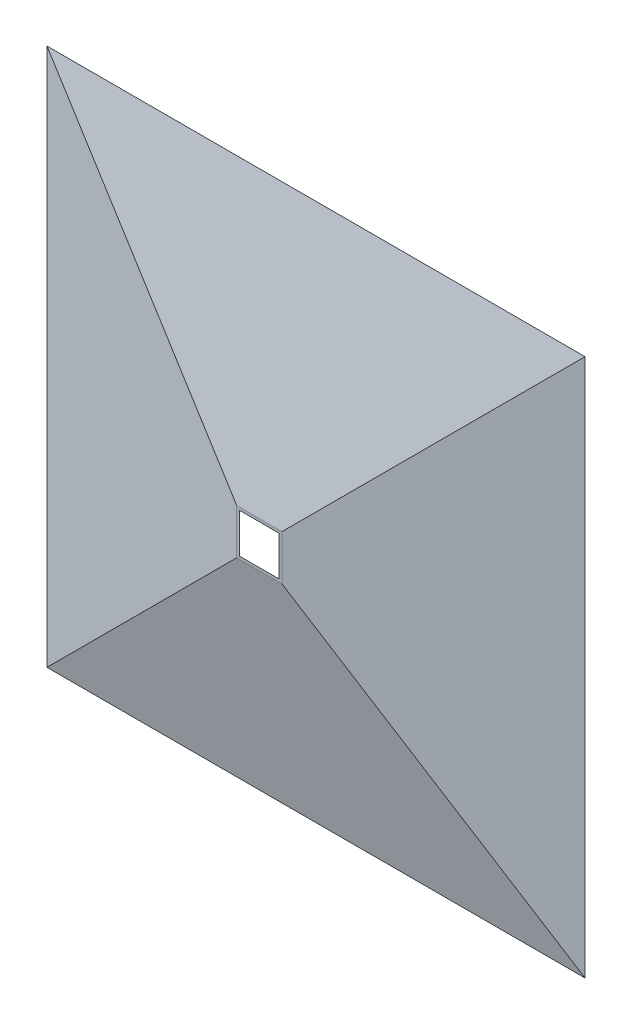
ISO-10303-21;
HEADER;
FILE_DESCRIPTION(('STEP AP214'),'2;1');
FILE_NAME('part.step','',(''),(''),'','','');
FILE_SCHEMA(('AUTOMOTIVE_DESIGN { 1 0 10303 214 1 1 1 1 }'));
ENDSEC;
DATA;
#1=APPLICATION_CONTEXT('core data for automotive mechanical design processes');
#2=APPLICATION_PROTOCOL_DEFINITION('international standard','automotive_design',2000,#1);
#3=PRODUCT_CONTEXT('',#1,'mechanical');
#4=PRODUCT('Part','Part','',(#3));
#5=PRODUCT_RELATED_PRODUCT_CATEGORY('part','',(#4));
#6=PRODUCT_DEFINITION_FORMATION('','',#4);
#7=PRODUCT_DEFINITION_CONTEXT('part definition',#1,'design');
#8=PRODUCT_DEFINITION('design','',#6,#7);
#9=PRODUCT_DEFINITION_SHAPE('','',#8);
#10=(LENGTH_UNIT() NAMED_UNIT(*) SI_UNIT(.MILLI.,.METRE.));
#11=(NAMED_UNIT(*) PLANE_ANGLE_UNIT() SI_UNIT($,.RADIAN.));
#12=(NAMED_UNIT(*) SI_UNIT($,.STERADIAN.) SOLID_ANGLE_UNIT());
#13=UNCERTAINTY_MEASURE_WITH_UNIT(LENGTH_MEASURE(1.E-05),#10,'distance_accuracy_value','');
#14=(GEOMETRIC_REPRESENTATION_CONTEXT(3) GLOBAL_UNCERTAINTY_ASSIGNED_CONTEXT((#13)) GLOBAL_UNIT_ASSIGNED_CONTEXT((#10,
#11,#12)) REPRESENTATION_CONTEXT('',''));
#15=CARTESIAN_POINT('',(0.,0.,0.));
#16=DIRECTION('',(0.,0.,1.));
#17=DIRECTION('',(1.,0.,0.));
#18=AXIS2_PLACEMENT_3D('',#15,#16,#17);
#19=CARTESIAN_POINT('',(0.,0.,100.));
#20=DIRECTION('',(0.,0.,1.));
#21=DIRECTION('',(1.,0.,0.));
#22=AXIS2_PLACEMENT_3D('',#19,#20,#21);
#23=PLANE('',#22);
#24=DIRECTION('',(0.,1.,0.));
#25=VECTOR('',#24,1.);
#26=CARTESIAN_POINT('',(40.,40.,100.));
#27=LINE('',#26,#25);
#28=CARTESIAN_POINT('',(39.9999999999999,-40.0000000000001,100.));
#29=VERTEX_POINT('',#28);
#30=CARTESIAN_POINT('',(40.,40.,100.));
#31=VERTEX_POINT('',#30);
#32=EDGE_CURVE('E234',#29,#31,#27,.T.);
#33=ORIENTED_EDGE('',*,*,#32,.T.);
#34=DIRECTION('',(-1.,0.,0.));
#35=VECTOR('',#34,1.);
#36=CARTESIAN_POINT('',(-40.,40.,100.));
#37=LINE('',#36,#35);
#38=CARTESIAN_POINT('',(-40.,40.,100.));
#39=VERTEX_POINT('',#38);
#40=EDGE_CURVE('E12',#31,#39,#37,.T.);
#41=ORIENTED_EDGE('',*,*,#40,.T.);
#42=DIRECTION('',(0.,-1.,0.));
#43=VECTOR('',#42,1.);
#44=CARTESIAN_POINT('',(-40.,40.,100.));
#45=LINE('',#44,#43);
#46=CARTESIAN_POINT('',(-40.,-40.,100.));
#47=VERTEX_POINT('',#46);
#48=EDGE_CURVE('E64',#39,#47,#45,.T.);
#49=ORIENTED_EDGE('',*,*,#48,.T.);
#50=DIRECTION('',(1.,0.,0.));
#51=VECTOR('',#50,1.);
#52=CARTESIAN_POINT('',(-40.,-40.,100.));
#53=LINE('',#52,#51);
#54=EDGE_CURVE('E235',#47,#29,#53,.T.);
#55=ORIENTED_EDGE('',*,*,#54,.T.);
#56=EDGE_LOOP('',(#33,#41,#49,#55));
#57=FACE_BOUND('',#56,.T.);
#58=DIRECTION('',(0.,-1.,0.));
#59=VECTOR('',#58,1.);
#60=CARTESIAN_POINT('',(-34.9999999999999,35.0000000000001,100.));
#61=LINE('',#60,#59);
#62=CARTESIAN_POINT('',(-34.9999999999999,35.0000000000001,100.));
#63=VERTEX_POINT('',#62);
#64=CARTESIAN_POINT('',(-34.9999999999999,-34.9999999999999,100.));
#65=VERTEX_POINT('',#64);
#66=EDGE_CURVE('E58',#63,#65,#61,.T.);
#67=ORIENTED_EDGE('',*,*,#66,.F.);
#68=DIRECTION('',(-1.,0.,0.));
#69=VECTOR('',#68,1.);
#70=CARTESIAN_POINT('',(-34.9999999999999,35.0000000000001,100.));
#71=LINE('',#70,#69);
#72=CARTESIAN_POINT('',(35.,35.0000000000001,100.));
#73=VERTEX_POINT('',#72);
#74=EDGE_CURVE('E143',#73,#63,#71,.T.);
#75=ORIENTED_EDGE('',*,*,#74,.F.);
#76=DIRECTION('',(0.,1.,0.));
#77=VECTOR('',#76,1.);
#78=CARTESIAN_POINT('',(35.,35.0000000000001,100.));
#79=LINE('',#78,#77);
#80=CARTESIAN_POINT('',(35.0000000000001,-34.9999999999999,100.));
#81=VERTEX_POINT('',#80);
#82=EDGE_CURVE('E352',#81,#73,#79,.T.);
#83=ORIENTED_EDGE('',*,*,#82,.F.);
#84=DIRECTION('',(1.,0.,0.));
#85=VECTOR('',#84,1.);
#86=CARTESIAN_POINT('',(-34.9999999999999,-34.9999999999999,100.));
#87=LINE('',#86,#85);
#88=EDGE_CURVE('E349',#65,#81,#87,.T.);
#89=ORIENTED_EDGE('',*,*,#88,.F.);
#90=EDGE_LOOP('',(#67,#75,#83,#89));
#91=FACE_BOUND('',#90,.T.);
#92=ADVANCED_FACE('F54',(#57,#91),#23,.T.);
#93=CARTESIAN_POINT('',(0.,0.,0.));
#94=DIRECTION('',(0.,0.,1.));
#95=DIRECTION('',(1.,0.,0.));
#96=AXIS2_PLACEMENT_3D('',#93,#94,#95);
#97=PLANE('',#96);
#98=DIRECTION('',(0.,1.,0.));
#99=VECTOR('',#98,1.);
#100=CARTESIAN_POINT('',(475.,475.,0.));
#101=LINE('',#100,#99);
#102=CARTESIAN_POINT('',(475.,-475.,0.));
#103=VERTEX_POINT('',#102);
#104=CARTESIAN_POINT('',(475.,475.,0.));
#105=VERTEX_POINT('',#104);
#106=EDGE_CURVE('E345',#103,#105,#101,.T.);
#107=ORIENTED_EDGE('',*,*,#106,.F.);
#108=DIRECTION('',(1.,0.,0.));
#109=VECTOR('',#108,1.);
#110=CARTESIAN_POINT('',(-475.,-475.,0.));
#111=LINE('',#110,#109);
#112=CARTESIAN_POINT('',(-475.,-475.,0.));
#113=VERTEX_POINT('',#112);
#114=EDGE_CURVE('E344',#113,#103,#111,.T.);
#115=ORIENTED_EDGE('',*,*,#114,.F.);
#116=DIRECTION('',(0.,-1.,0.));
#117=VECTOR('',#116,1.);
#118=CARTESIAN_POINT('',(-475.,475.,0.));
#119=LINE('',#118,#117);
#120=CARTESIAN_POINT('',(-475.,475.,0.));
#121=VERTEX_POINT('',#120);
#122=EDGE_CURVE('E288',#121,#113,#119,.T.);
#123=ORIENTED_EDGE('',*,*,#122,.F.);
#124=DIRECTION('',(-1.,0.,0.));
#125=VECTOR('',#124,1.);
#126=CARTESIAN_POINT('',(-475.,475.,0.));
#127=LINE('',#126,#125);
#128=EDGE_CURVE('E276',#105,#121,#127,.T.);
#129=ORIENTED_EDGE('',*,*,#128,.F.);
#130=EDGE_LOOP('',(#107,#115,#123,#129));
#131=FACE_BOUND('',#130,.T.);
#132=DIRECTION('',(1.,0.,0.));
#133=VECTOR('',#132,1.);
#134=CARTESIAN_POINT('',(-470.,470.,0.));
#135=LINE('',#134,#133);
#136=CARTESIAN_POINT('',(-470.,470.,0.));
#137=VERTEX_POINT('',#136);
#138=CARTESIAN_POINT('',(470.,470.,0.));
#139=VERTEX_POINT('',#138);
#140=EDGE_CURVE('E135',#137,#139,#135,.T.);
#141=ORIENTED_EDGE('',*,*,#140,.F.);
#142=DIRECTION('',(0.,1.,0.));
#143=VECTOR('',#142,1.);
#144=CARTESIAN_POINT('',(-470.,-470.,0.));
#145=LINE('',#144,#143);
#146=CARTESIAN_POINT('',(-470.,-470.,0.));
#147=VERTEX_POINT('',#146);
#148=EDGE_CURVE('E124',#147,#137,#145,.T.);
#149=ORIENTED_EDGE('',*,*,#148,.F.);
#150=DIRECTION('',(-1.,0.,0.));
#151=VECTOR('',#150,1.);
#152=CARTESIAN_POINT('',(-470.,-470.,0.));
#153=LINE('',#152,#151);
#154=CARTESIAN_POINT('',(470.,-470.,0.));
#155=VERTEX_POINT('',#154);
#156=EDGE_CURVE('E134',#155,#147,#153,.T.);
#157=ORIENTED_EDGE('',*,*,#156,.F.);
#158=DIRECTION('',(0.,-1.,0.));
#159=VECTOR('',#158,1.);
#160=CARTESIAN_POINT('',(470.,-470.,0.));
#161=LINE('',#160,#159);
#162=EDGE_CURVE('E80',#139,#155,#161,.T.);
#163=ORIENTED_EDGE('',*,*,#162,.F.);
#164=EDGE_LOOP('',(#141,#149,#157,#163));
#165=FACE_BOUND('',#164,.T.);
#166=ADVANCED_FACE('F148',(#131,#165),#97,.F.);
#167=CARTESIAN_POINT('',(0.,-23.8423892583762,103.714393273936));
#168=DIRECTION('',(0.,0.224041299098726,-0.974579651079457));
#169=DIRECTION('',(0.,0.974579651079457,0.224041299098726));
#170=AXIS2_PLACEMENT_3D('',#167,#168,#169);
#171=PLANE('',#170);
#172=DIRECTION('',(-0.697945793414125,0.697945793414124,0.160447308830833));
#173=VECTOR('',#172,1.);
#174=CARTESIAN_POINT('',(475.,-475.,0.));
#175=LINE('',#174,#173);
#176=EDGE_CURVE('E339',#103,#29,#175,.T.);
#177=ORIENTED_EDGE('',*,*,#176,.T.);
#178=ORIENTED_EDGE('',*,*,#54,.F.);
#179=DIRECTION('',(0.697945793414125,0.697945793414124,0.160447308830833));
#180=VECTOR('',#179,1.);
#181=CARTESIAN_POINT('',(-475.,-475.,0.));
#182=LINE('',#181,#180);
#183=EDGE_CURVE('E272',#113,#47,#182,.T.);
#184=ORIENTED_EDGE('',*,*,#183,.F.);
#185=ORIENTED_EDGE('',*,*,#114,.T.);
#186=EDGE_LOOP('',(#177,#178,#184,#185));
#187=FACE_BOUND('',#186,.T.);
#188=ADVANCED_FACE('F170',(#187),#171,.F.);
#189=CARTESIAN_POINT('',(-23.8423892583762,0.,103.714393273936));
#190=DIRECTION('',(0.224041299098726,0.,-0.974579651079457));
#191=DIRECTION('',(-0.974579651079457,0.,-0.224041299098726));
#192=AXIS2_PLACEMENT_3D('',#189,#190,#191);
#193=PLANE('',#192);
#194=ORIENTED_EDGE('',*,*,#183,.T.);
#195=ORIENTED_EDGE('',*,*,#48,.F.);
#196=DIRECTION('',(0.697945793414124,-0.697945793414124,0.160447308830833));
#197=VECTOR('',#196,1.);
#198=CARTESIAN_POINT('',(-475.,475.,0.));
#199=LINE('',#198,#197);
#200=EDGE_CURVE('E256',#121,#39,#199,.T.);
#201=ORIENTED_EDGE('',*,*,#200,.F.);
#202=ORIENTED_EDGE('',*,*,#122,.T.);
#203=EDGE_LOOP('',(#194,#195,#201,#202));
#204=FACE_BOUND('',#203,.T.);
#205=ADVANCED_FACE('F269',(#204),#193,.F.);
#206=CARTESIAN_POINT('',(23.8423892583762,0.,103.714393273936));
#207=DIRECTION('',(-0.224041299098726,0.,-0.974579651079457));
#208=DIRECTION('',(-0.974579651079457,0.,0.224041299098726));
#209=AXIS2_PLACEMENT_3D('',#206,#207,#208);
#210=PLANE('',#209);
#211=DIRECTION('',(-0.697945793414124,-0.697945793414125,0.160447308830833));
#212=VECTOR('',#211,1.);
#213=CARTESIAN_POINT('',(475.,475.,0.));
#214=LINE('',#213,#212);
#215=EDGE_CURVE('E279',#105,#31,#214,.T.);
#216=ORIENTED_EDGE('',*,*,#215,.T.);
#217=ORIENTED_EDGE('',*,*,#32,.F.);
#218=ORIENTED_EDGE('',*,*,#176,.F.);
#219=ORIENTED_EDGE('',*,*,#106,.T.);
#220=EDGE_LOOP('',(#216,#217,#218,#219));
#221=FACE_BOUND('',#220,.T.);
#222=ADVANCED_FACE('F301',(#221),#210,.F.);
#223=CARTESIAN_POINT('',(0.,23.8423892583762,103.714393273936));
#224=DIRECTION('',(0.,-0.224041299098726,-0.974579651079457));
#225=DIRECTION('',(0.,0.974579651079457,-0.224041299098726));
#226=AXIS2_PLACEMENT_3D('',#223,#224,#225);
#227=PLANE('',#226);
#228=ORIENTED_EDGE('',*,*,#200,.T.);
#229=ORIENTED_EDGE('',*,*,#40,.F.);
#230=ORIENTED_EDGE('',*,*,#215,.F.);
#231=ORIENTED_EDGE('',*,*,#128,.T.);
#232=EDGE_LOOP('',(#228,#229,#230,#231));
#233=FACE_BOUND('',#232,.T.);
#234=ADVANCED_FACE('F275',(#233),#227,.F.);
#235=CARTESIAN_POINT('',(0.,23.591416739867,102.622662818421));
#236=DIRECTION('',(0.,-0.224041299098726,-0.974579651079457));
#237=DIRECTION('',(0.,0.974579651079457,-0.224041299098726));
#238=AXIS2_PLACEMENT_3D('',#235,#236,#237);
#239=PLANE('',#238);
#240=DIRECTION('',(0.697945793414124,-0.697945793414124,0.160447308830833));
#241=VECTOR('',#240,1.);
#242=CARTESIAN_POINT('',(-470.,470.,0.));
#243=LINE('',#242,#241);
#244=EDGE_CURVE('E128',#137,#63,#243,.T.);
#245=ORIENTED_EDGE('',*,*,#244,.F.);
#246=ORIENTED_EDGE('',*,*,#140,.T.);
#247=DIRECTION('',(-0.697945793414125,-0.697945793414124,0.160447308830833));
#248=VECTOR('',#247,1.);
#249=CARTESIAN_POINT('',(470.,470.,0.));
#250=LINE('',#249,#248);
#251=EDGE_CURVE('E145',#139,#73,#250,.T.);
#252=ORIENTED_EDGE('',*,*,#251,.T.);
#253=ORIENTED_EDGE('',*,*,#74,.T.);
#254=EDGE_LOOP('',(#245,#246,#252,#253));
#255=FACE_BOUND('',#254,.T.);
#256=ADVANCED_FACE('F140',(#255),#239,.T.);
#257=CARTESIAN_POINT('',(23.591416739867,0.,102.622662818421));
#258=DIRECTION('',(-0.224041299098726,0.,-0.974579651079457));
#259=DIRECTION('',(-0.974579651079457,0.,0.224041299098726));
#260=AXIS2_PLACEMENT_3D('',#257,#258,#259);
#261=PLANE('',#260);
#262=ORIENTED_EDGE('',*,*,#251,.F.);
#263=ORIENTED_EDGE('',*,*,#162,.T.);
#264=DIRECTION('',(-0.697945793414124,0.697945793414124,0.160447308830833));
#265=VECTOR('',#264,1.);
#266=CARTESIAN_POINT('',(470.,-470.,0.));
#267=LINE('',#266,#265);
#268=EDGE_CURVE('E458',#155,#81,#267,.T.);
#269=ORIENTED_EDGE('',*,*,#268,.T.);
#270=ORIENTED_EDGE('',*,*,#82,.T.);
#271=EDGE_LOOP('',(#262,#263,#269,#270));
#272=FACE_BOUND('',#271,.T.);
#273=ADVANCED_FACE('F426',(#272),#261,.T.);
#274=CARTESIAN_POINT('',(-23.591416739867,0.,102.622662818421));
#275=DIRECTION('',(0.224041299098726,0.,-0.974579651079457));
#276=DIRECTION('',(-0.974579651079457,0.,-0.224041299098726));
#277=AXIS2_PLACEMENT_3D('',#274,#275,#276);
#278=PLANE('',#277);
#279=DIRECTION('',(0.697945793414124,0.697945793414124,0.160447308830833));
#280=VECTOR('',#279,1.);
#281=CARTESIAN_POINT('',(-470.,-470.,0.));
#282=LINE('',#281,#280);
#283=EDGE_CURVE('E72',#147,#65,#282,.T.);
#284=ORIENTED_EDGE('',*,*,#283,.F.);
#285=ORIENTED_EDGE('',*,*,#148,.T.);
#286=ORIENTED_EDGE('',*,*,#244,.T.);
#287=ORIENTED_EDGE('',*,*,#66,.T.);
#288=EDGE_LOOP('',(#284,#285,#286,#287));
#289=FACE_BOUND('',#288,.T.);
#290=ADVANCED_FACE('F127',(#289),#278,.T.);
#291=CARTESIAN_POINT('',(0.,-23.591416739867,102.622662818421));
#292=DIRECTION('',(0.,0.224041299098726,-0.974579651079457));
#293=DIRECTION('',(0.,0.974579651079457,0.224041299098726));
#294=AXIS2_PLACEMENT_3D('',#291,#292,#293);
#295=PLANE('',#294);
#296=ORIENTED_EDGE('',*,*,#268,.F.);
#297=ORIENTED_EDGE('',*,*,#156,.T.);
#298=ORIENTED_EDGE('',*,*,#283,.T.);
#299=ORIENTED_EDGE('',*,*,#88,.T.);
#300=EDGE_LOOP('',(#296,#297,#298,#299));
#301=FACE_BOUND('',#300,.T.);
#302=ADVANCED_FACE('F172',(#301),#295,.T.);
#303=CLOSED_SHELL('',(#92,#166,#188,#205,#222,#234,#256,#273,#290,#302));
#304=MANIFOLD_SOLID_BREP('B2',#303);
#305=ADVANCED_BREP_SHAPE_REPRESENTATION('',(#18,#304),#14);
#306=SHAPE_DEFINITION_REPRESENTATION(#9,#305);
ENDSEC;
END-ISO-10303-21;
